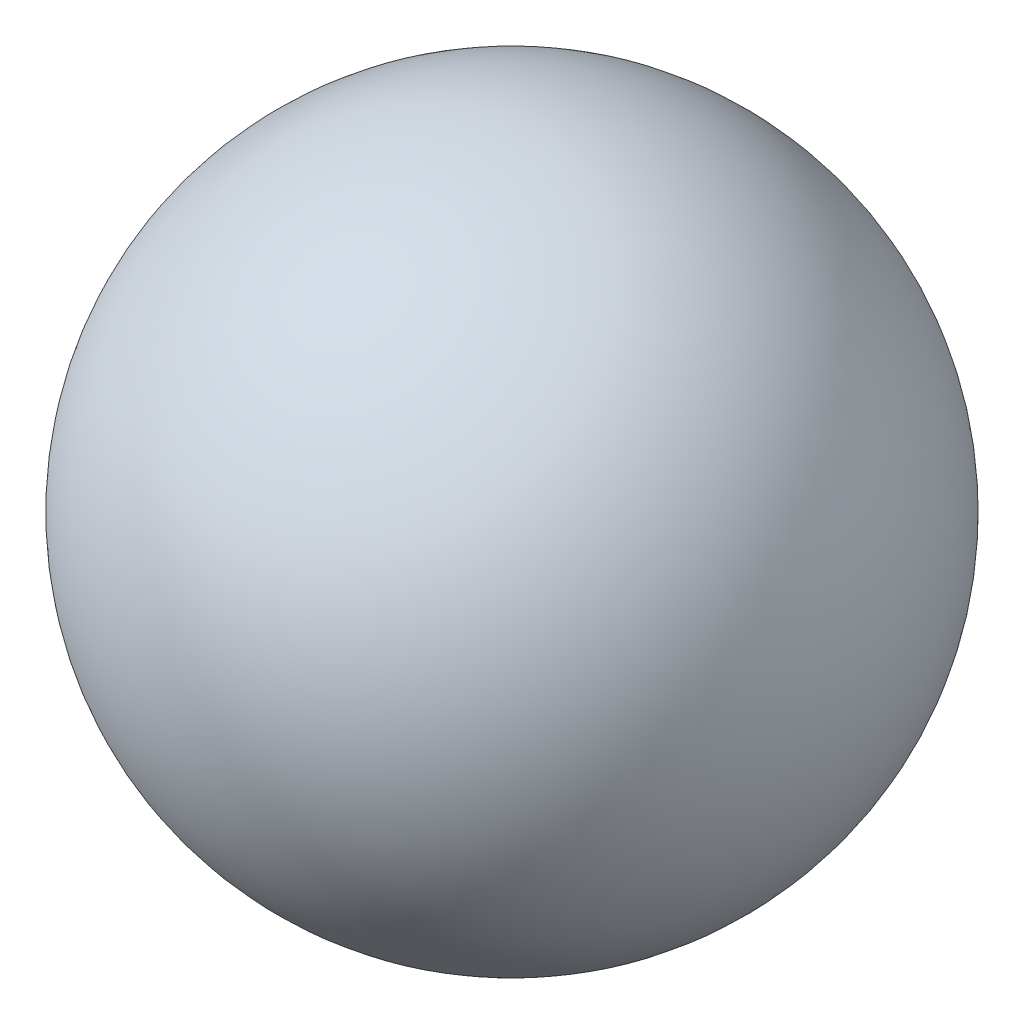
ISO-10303-21;
HEADER;
FILE_DESCRIPTION(('STEP AP214'),'2;1');
FILE_NAME('part.step','',(''),(''),'','','');
FILE_SCHEMA(('AUTOMOTIVE_DESIGN { 1 0 10303 214 1 1 1 1 }'));
ENDSEC;
DATA;
#1=APPLICATION_CONTEXT('core data for automotive mechanical design processes');
#2=APPLICATION_PROTOCOL_DEFINITION('international standard','automotive_design',2000,#1);
#3=PRODUCT_CONTEXT('',#1,'mechanical');
#4=PRODUCT('Part','Part','',(#3));
#5=PRODUCT_RELATED_PRODUCT_CATEGORY('part','',(#4));
#6=PRODUCT_DEFINITION_FORMATION('','',#4);
#7=PRODUCT_DEFINITION_CONTEXT('part definition',#1,'design');
#8=PRODUCT_DEFINITION('design','',#6,#7);
#9=PRODUCT_DEFINITION_SHAPE('','',#8);
#10=(LENGTH_UNIT() NAMED_UNIT(*) SI_UNIT(.MILLI.,.METRE.));
#11=(NAMED_UNIT(*) PLANE_ANGLE_UNIT() SI_UNIT($,.RADIAN.));
#12=(NAMED_UNIT(*) SI_UNIT($,.STERADIAN.) SOLID_ANGLE_UNIT());
#13=UNCERTAINTY_MEASURE_WITH_UNIT(LENGTH_MEASURE(1.E-05),#10,'distance_accuracy_value','');
#14=(GEOMETRIC_REPRESENTATION_CONTEXT(3) GLOBAL_UNCERTAINTY_ASSIGNED_CONTEXT((#13)) GLOBAL_UNIT_ASSIGNED_CONTEXT((#10,
#11,#12)) REPRESENTATION_CONTEXT('',''));
#15=CARTESIAN_POINT('',(0.,0.,0.));
#16=DIRECTION('',(0.,0.,1.));
#17=DIRECTION('',(1.,0.,0.));
#18=AXIS2_PLACEMENT_3D('',#15,#16,#17);
#19=CARTESIAN_POINT('',(0.,0.,0.));
#20=DIRECTION('',(0.,1.,0.));
#21=DIRECTION('',(0.,0.,-1.));
#22=AXIS2_PLACEMENT_3D('',#19,#20,#21);
#23=SPHERICAL_SURFACE('',#22,13.9436790915572);
#24=CARTESIAN_POINT('',(0.,13.9436790915572,0.));
#25=VERTEX_POINT('',#24);
#26=VERTEX_LOOP('',#25);
#27=FACE_BOUND('',#26,.T.);
#28=ADVANCED_FACE('F29',(#27),#23,.T.);
#29=CLOSED_SHELL('',(#28));
#30=MANIFOLD_SOLID_BREP('B2',#29);
#31=ADVANCED_BREP_SHAPE_REPRESENTATION('',(#18,#30),#14);
#32=SHAPE_DEFINITION_REPRESENTATION(#9,#31);
ENDSEC;
END-ISO-10303-21;
